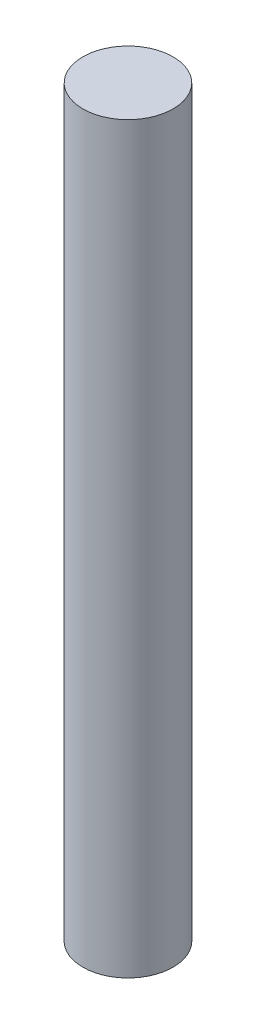
ISO-10303-21;
HEADER;
FILE_DESCRIPTION(('STEP AP214'),'2;1');
FILE_NAME('part.step','',(''),(''),'','','');
FILE_SCHEMA(('AUTOMOTIVE_DESIGN { 1 0 10303 214 1 1 1 1 }'));
ENDSEC;
DATA;
#1=APPLICATION_CONTEXT('core data for automotive mechanical design processes');
#2=APPLICATION_PROTOCOL_DEFINITION('international standard','automotive_design',2000,#1);
#3=PRODUCT_CONTEXT('',#1,'mechanical');
#4=PRODUCT('Part','Part','',(#3));
#5=PRODUCT_RELATED_PRODUCT_CATEGORY('part','',(#4));
#6=PRODUCT_DEFINITION_FORMATION('','',#4);
#7=PRODUCT_DEFINITION_CONTEXT('part definition',#1,'design');
#8=PRODUCT_DEFINITION('design','',#6,#7);
#9=PRODUCT_DEFINITION_SHAPE('','',#8);
#10=(LENGTH_UNIT() NAMED_UNIT(*) SI_UNIT(.MILLI.,.METRE.));
#11=(NAMED_UNIT(*) PLANE_ANGLE_UNIT() SI_UNIT($,.RADIAN.));
#12=(NAMED_UNIT(*) SI_UNIT($,.STERADIAN.) SOLID_ANGLE_UNIT());
#13=UNCERTAINTY_MEASURE_WITH_UNIT(LENGTH_MEASURE(1.E-05),#10,'distance_accuracy_value','');
#14=(GEOMETRIC_REPRESENTATION_CONTEXT(3) GLOBAL_UNCERTAINTY_ASSIGNED_CONTEXT((#13)) GLOBAL_UNIT_ASSIGNED_CONTEXT((#10,
#11,#12)) REPRESENTATION_CONTEXT('',''));
#15=CARTESIAN_POINT('',(0.,0.,0.));
#16=DIRECTION('',(0.,0.,1.));
#17=DIRECTION('',(1.,0.,0.));
#18=AXIS2_PLACEMENT_3D('',#15,#16,#17);
#19=CARTESIAN_POINT('',(0.,14.,0.));
#20=DIRECTION('',(0.,-1.,0.));
#21=DIRECTION('',(0.,0.,-1.));
#22=AXIS2_PLACEMENT_3D('',#19,#20,#21);
#23=CYLINDRICAL_SURFACE('',#22,0.85);
#24=CARTESIAN_POINT('',(0.,14.,0.));
#25=DIRECTION('',(0.,1.,0.));
#26=DIRECTION('',(0.,0.,1.));
#27=AXIS2_PLACEMENT_3D('',#24,#25,#26);
#28=CIRCLE('',#27,0.85);
#29=CARTESIAN_POINT('',(0.,14.,0.85));
#30=VERTEX_POINT('',#29);
#31=EDGE_CURVE('E10',#30,#30,#28,.T.);
#32=ORIENTED_EDGE('',*,*,#31,.F.);
#33=EDGE_LOOP('',(#32));
#34=FACE_BOUND('',#33,.T.);
#35=CARTESIAN_POINT('',(0.,0.,0.));
#36=DIRECTION('',(0.,1.,0.));
#37=DIRECTION('',(0.,0.,1.));
#38=AXIS2_PLACEMENT_3D('',#35,#36,#37);
#39=CIRCLE('',#38,0.85);
#40=CARTESIAN_POINT('',(0.,0.,0.85));
#41=VERTEX_POINT('',#40);
#42=EDGE_CURVE('E46',#41,#41,#39,.T.);
#43=ORIENTED_EDGE('',*,*,#42,.T.);
#44=EDGE_LOOP('',(#43));
#45=FACE_BOUND('',#44,.T.);
#46=ADVANCED_FACE('F43',(#34,#45),#23,.T.);
#47=CARTESIAN_POINT('',(0.,14.,0.));
#48=DIRECTION('',(0.,1.,0.));
#49=DIRECTION('',(0.,0.,1.));
#50=AXIS2_PLACEMENT_3D('',#47,#48,#49);
#51=PLANE('',#50);
#52=ORIENTED_EDGE('',*,*,#31,.T.);
#53=EDGE_LOOP('',(#52));
#54=FACE_BOUND('',#53,.T.);
#55=ADVANCED_FACE('F60',(#54),#51,.T.);
#56=CARTESIAN_POINT('',(0.,0.,0.));
#57=DIRECTION('',(0.,1.,0.));
#58=DIRECTION('',(0.,0.,1.));
#59=AXIS2_PLACEMENT_3D('',#56,#57,#58);
#60=PLANE('',#59);
#61=ORIENTED_EDGE('',*,*,#42,.F.);
#62=EDGE_LOOP('',(#61));
#63=FACE_BOUND('',#62,.T.);
#64=ADVANCED_FACE('F58',(#63),#60,.F.);
#65=CLOSED_SHELL('',(#46,#55,#64));
#66=MANIFOLD_SOLID_BREP('B2',#65);
#67=ADVANCED_BREP_SHAPE_REPRESENTATION('',(#18,#66),#14);
#68=SHAPE_DEFINITION_REPRESENTATION(#9,#67);
ENDSEC;
END-ISO-10303-21;
